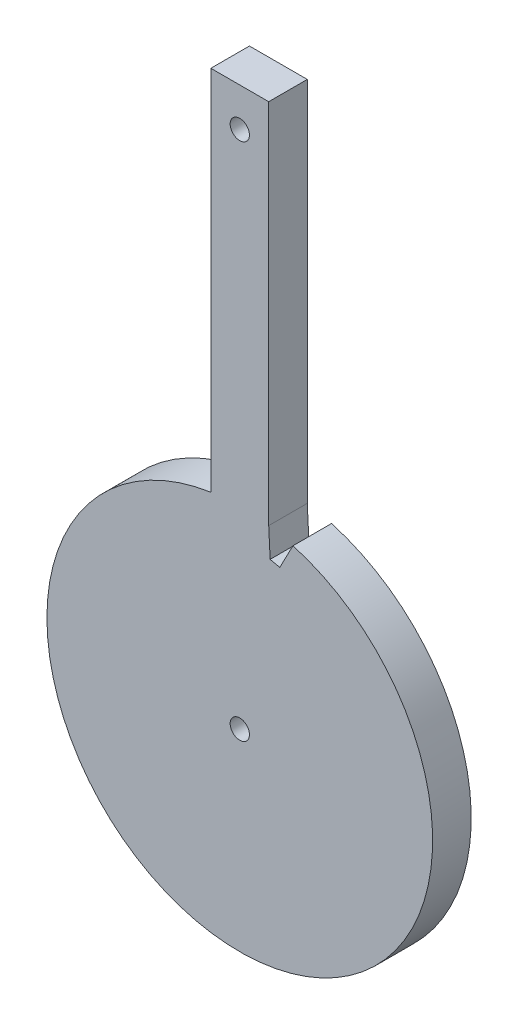
ISO-10303-21;
HEADER;
FILE_DESCRIPTION(('STEP AP214'),'2;1');
FILE_NAME('part.step','',(''),(''),'','','');
FILE_SCHEMA(('AUTOMOTIVE_DESIGN { 1 0 10303 214 1 1 1 1 }'));
ENDSEC;
DATA;
#1=APPLICATION_CONTEXT('core data for automotive mechanical design processes');
#2=APPLICATION_PROTOCOL_DEFINITION('international standard','automotive_design',2000,#1);
#3=PRODUCT_CONTEXT('',#1,'mechanical');
#4=PRODUCT('Part','Part','',(#3));
#5=PRODUCT_RELATED_PRODUCT_CATEGORY('part','',(#4));
#6=PRODUCT_DEFINITION_FORMATION('','',#4);
#7=PRODUCT_DEFINITION_CONTEXT('part definition',#1,'design');
#8=PRODUCT_DEFINITION('design','',#6,#7);
#9=PRODUCT_DEFINITION_SHAPE('','',#8);
#10=(LENGTH_UNIT() NAMED_UNIT(*) SI_UNIT(.MILLI.,.METRE.));
#11=(NAMED_UNIT(*) PLANE_ANGLE_UNIT() SI_UNIT($,.RADIAN.));
#12=(NAMED_UNIT(*) SI_UNIT($,.STERADIAN.) SOLID_ANGLE_UNIT());
#13=UNCERTAINTY_MEASURE_WITH_UNIT(LENGTH_MEASURE(1.E-05),#10,'distance_accuracy_value','');
#14=(GEOMETRIC_REPRESENTATION_CONTEXT(3) GLOBAL_UNCERTAINTY_ASSIGNED_CONTEXT((#13)) GLOBAL_UNIT_ASSIGNED_CONTEXT((#10,
#11,#12)) REPRESENTATION_CONTEXT('',''));
#15=CARTESIAN_POINT('',(0.,0.,0.));
#16=DIRECTION('',(0.,0.,1.));
#17=DIRECTION('',(1.,0.,0.));
#18=AXIS2_PLACEMENT_3D('',#15,#16,#17);
#19=CARTESIAN_POINT('',(0.,0.,-10.));
#20=DIRECTION('',(0.,0.,1.));
#21=DIRECTION('',(1.,0.,0.));
#22=AXIS2_PLACEMENT_3D('',#19,#20,#21);
#23=CYLINDRICAL_SURFACE('',#22,50.);
#24=CARTESIAN_POINT('',(0.,0.,-10.));
#25=DIRECTION('',(0.,0.,1.));
#26=DIRECTION('',(1.,0.,0.));
#27=AXIS2_PLACEMENT_3D('',#24,#25,#26);
#28=CIRCLE('',#27,50.);
#29=CARTESIAN_POINT('',(-7.49999999999999,49.434299833213,-10.));
#30=VERTEX_POINT('',#29);
#31=CARTESIAN_POINT('',(13.7917102938844,48.0602614138704,-10.));
#32=VERTEX_POINT('',#31);
#33=EDGE_CURVE('E120',#30,#32,#28,.T.);
#34=ORIENTED_EDGE('',*,*,#33,.T.);
#35=DIRECTION('',(0.,0.,-1.));
#36=VECTOR('',#35,1.);
#37=CARTESIAN_POINT('',(13.7917102938844,48.0602614138704,-10.));
#38=LINE('',#37,#36);
#39=CARTESIAN_POINT('',(13.7917102938844,48.0602614138704,0.));
#40=VERTEX_POINT('',#39);
#41=EDGE_CURVE('E108',#32,#40,#38,.F.);
#42=ORIENTED_EDGE('',*,*,#41,.T.);
#43=CARTESIAN_POINT('',(0.,0.,0.));
#44=DIRECTION('',(0.,0.,1.));
#45=DIRECTION('',(1.,0.,0.));
#46=AXIS2_PLACEMENT_3D('',#43,#44,#45);
#47=CIRCLE('',#46,50.);
#48=CARTESIAN_POINT('',(-7.49999999999999,49.434299833213,0.));
#49=VERTEX_POINT('',#48);
#50=EDGE_CURVE('E118',#49,#40,#47,.T.);
#51=ORIENTED_EDGE('',*,*,#50,.F.);
#52=DIRECTION('',(0.,0.,1.));
#53=VECTOR('',#52,1.);
#54=CARTESIAN_POINT('',(-7.49999999999999,49.434299833213,-10.));
#55=LINE('',#54,#53);
#56=EDGE_CURVE('E11',#30,#49,#55,.T.);
#57=ORIENTED_EDGE('',*,*,#56,.F.);
#58=EDGE_LOOP('',(#34,#42,#51,#57));
#59=FACE_BOUND('',#58,.T.);
#60=ADVANCED_FACE('F38',(#59),#23,.T.);
#61=CARTESIAN_POINT('',(0.,0.,-10.));
#62=DIRECTION('',(0.,0.,1.));
#63=DIRECTION('',(1.,0.,0.));
#64=AXIS2_PLACEMENT_3D('',#61,#62,#63);
#65=PLANE('',#64);
#66=CARTESIAN_POINT('',(0.,134.62,-10.));
#67=DIRECTION('',(0.,0.,1.));
#68=DIRECTION('',(1.,0.,0.));
#69=AXIS2_PLACEMENT_3D('',#66,#67,#68);
#70=CIRCLE('',#69,2.5);
#71=CARTESIAN_POINT('',(2.5,134.62,-10.));
#72=VERTEX_POINT('',#71);
#73=EDGE_CURVE('E126',#72,#72,#70,.F.);
#74=ORIENTED_EDGE('',*,*,#73,.F.);
#75=EDGE_LOOP('',(#74));
#76=FACE_BOUND('',#75,.T.);
#77=CARTESIAN_POINT('',(0.,0.,-10.));
#78=DIRECTION('',(0.,0.,1.));
#79=DIRECTION('',(1.,0.,0.));
#80=AXIS2_PLACEMENT_3D('',#77,#78,#79);
#81=CIRCLE('',#80,2.5);
#82=CARTESIAN_POINT('',(2.5,0.,-10.));
#83=VERTEX_POINT('',#82);
#84=EDGE_CURVE('E154',#83,#83,#81,.F.);
#85=ORIENTED_EDGE('',*,*,#84,.F.);
#86=EDGE_LOOP('',(#85));
#87=FACE_BOUND('',#86,.T.);
#88=DIRECTION('',(-0.0502280357856031,0.998737775605349,0.));
#89=VECTOR('',#88,1.);
#90=CARTESIAN_POINT('',(7.5,49.434299833213,-10.));
#91=LINE('',#90,#89);
#92=CARTESIAN_POINT('',(7.87168746481346,42.0436402937334,-10.));
#93=VERTEX_POINT('',#92);
#94=CARTESIAN_POINT('',(7.5,49.434299833213,-10.));
#95=VERTEX_POINT('',#94);
#96=EDGE_CURVE('E116',#93,#95,#91,.T.);
#97=ORIENTED_EDGE('',*,*,#96,.F.);
#98=DIRECTION('',(-0.976973648118693,0.213360003003499,0.));
#99=VECTOR('',#98,1.);
#100=CARTESIAN_POINT('',(7.87168746481346,42.0436402937334,-10.));
#101=LINE('',#100,#99);
#102=CARTESIAN_POINT('',(10.3727400039973,41.4974386860444,-10.));
#103=VERTEX_POINT('',#102);
#104=EDGE_CURVE('E164',#103,#93,#101,.T.);
#105=ORIENTED_EDGE('',*,*,#104,.F.);
#106=DIRECTION('',(-0.4620230121469,-0.886867936192704,0.));
#107=VECTOR('',#106,1.);
#108=CARTESIAN_POINT('',(10.3727400039973,41.4974386860444,-10.));
#109=LINE('',#108,#107);
#110=EDGE_CURVE('E166',#32,#103,#109,.T.);
#111=ORIENTED_EDGE('',*,*,#110,.F.);
#112=ORIENTED_EDGE('',*,*,#33,.F.);
#113=DIRECTION('',(0.,-1.,0.));
#114=VECTOR('',#113,1.);
#115=CARTESIAN_POINT('',(-7.5,144.62,-10.));
#116=LINE('',#115,#114);
#117=CARTESIAN_POINT('',(-7.5,144.62,-10.));
#118=VERTEX_POINT('',#117);
#119=EDGE_CURVE('E135',#118,#30,#116,.T.);
#120=ORIENTED_EDGE('',*,*,#119,.F.);
#121=DIRECTION('',(-1.,0.,0.));
#122=VECTOR('',#121,1.);
#123=CARTESIAN_POINT('',(7.5,144.62,-10.));
#124=LINE('',#123,#122);
#125=CARTESIAN_POINT('',(7.5,144.62,-10.));
#126=VERTEX_POINT('',#125);
#127=EDGE_CURVE('E146',#126,#118,#124,.T.);
#128=ORIENTED_EDGE('',*,*,#127,.F.);
#129=DIRECTION('',(0.,1.,0.));
#130=VECTOR('',#129,1.);
#131=CARTESIAN_POINT('',(7.5,49.434299833213,-10.));
#132=LINE('',#131,#130);
#133=EDGE_CURVE('E148',#95,#126,#132,.T.);
#134=ORIENTED_EDGE('',*,*,#133,.F.);
#135=EDGE_LOOP('',(#97,#105,#111,#112,#120,#128,#134));
#136=FACE_BOUND('',#135,.T.);
#137=ADVANCED_FACE('F173',(#76,#87,#136),#65,.F.);
#138=CARTESIAN_POINT('',(0.,0.,0.));
#139=DIRECTION('',(0.,0.,1.));
#140=DIRECTION('',(1.,0.,0.));
#141=AXIS2_PLACEMENT_3D('',#138,#139,#140);
#142=PLANE('',#141);
#143=CARTESIAN_POINT('',(0.,134.62,0.));
#144=DIRECTION('',(0.,0.,1.));
#145=DIRECTION('',(1.,0.,0.));
#146=AXIS2_PLACEMENT_3D('',#143,#144,#145);
#147=CIRCLE('',#146,2.5);
#148=CARTESIAN_POINT('',(2.5,134.62,0.));
#149=VERTEX_POINT('',#148);
#150=EDGE_CURVE('E132',#149,#149,#147,.T.);
#151=ORIENTED_EDGE('',*,*,#150,.F.);
#152=EDGE_LOOP('',(#151));
#153=FACE_BOUND('',#152,.T.);
#154=CARTESIAN_POINT('',(0.,0.,0.));
#155=DIRECTION('',(0.,0.,1.));
#156=DIRECTION('',(1.,0.,0.));
#157=AXIS2_PLACEMENT_3D('',#154,#155,#156);
#158=CIRCLE('',#157,2.5);
#159=CARTESIAN_POINT('',(2.5,0.,0.));
#160=VERTEX_POINT('',#159);
#161=EDGE_CURVE('E157',#160,#160,#158,.T.);
#162=ORIENTED_EDGE('',*,*,#161,.F.);
#163=EDGE_LOOP('',(#162));
#164=FACE_BOUND('',#163,.T.);
#165=DIRECTION('',(-0.976973648118693,0.213360003003499,0.));
#166=VECTOR('',#165,1.);
#167=CARTESIAN_POINT('',(7.87168746481346,42.0436402937334,0.));
#168=LINE('',#167,#166);
#169=CARTESIAN_POINT('',(10.3727400039973,41.4974386860444,0.));
#170=VERTEX_POINT('',#169);
#171=CARTESIAN_POINT('',(7.87168746481346,42.0436402937334,0.));
#172=VERTEX_POINT('',#171);
#173=EDGE_CURVE('E115',#170,#172,#168,.T.);
#174=ORIENTED_EDGE('',*,*,#173,.T.);
#175=DIRECTION('',(-0.0502280357856031,0.998737775605349,0.));
#176=VECTOR('',#175,1.);
#177=CARTESIAN_POINT('',(7.5,49.434299833213,0.));
#178=LINE('',#177,#176);
#179=CARTESIAN_POINT('',(7.5,49.434299833213,0.));
#180=VERTEX_POINT('',#179);
#181=EDGE_CURVE('E161',#172,#180,#178,.T.);
#182=ORIENTED_EDGE('',*,*,#181,.T.);
#183=DIRECTION('',(0.,1.,0.));
#184=VECTOR('',#183,1.);
#185=CARTESIAN_POINT('',(7.5,49.434299833213,0.));
#186=LINE('',#185,#184);
#187=CARTESIAN_POINT('',(7.5,144.62,0.));
#188=VERTEX_POINT('',#187);
#189=EDGE_CURVE('E125',#180,#188,#186,.T.);
#190=ORIENTED_EDGE('',*,*,#189,.T.);
#191=DIRECTION('',(-1.,0.,0.));
#192=VECTOR('',#191,1.);
#193=CARTESIAN_POINT('',(7.5,144.62,0.));
#194=LINE('',#193,#192);
#195=CARTESIAN_POINT('',(-7.5,144.62,0.));
#196=VERTEX_POINT('',#195);
#197=EDGE_CURVE('E129',#188,#196,#194,.T.);
#198=ORIENTED_EDGE('',*,*,#197,.T.);
#199=DIRECTION('',(0.,-1.,0.));
#200=VECTOR('',#199,1.);
#201=CARTESIAN_POINT('',(-7.5,144.62,0.));
#202=LINE('',#201,#200);
#203=EDGE_CURVE('E124',#196,#49,#202,.T.);
#204=ORIENTED_EDGE('',*,*,#203,.T.);
#205=ORIENTED_EDGE('',*,*,#50,.T.);
#206=DIRECTION('',(-0.4620230121469,-0.886867936192704,0.));
#207=VECTOR('',#206,1.);
#208=CARTESIAN_POINT('',(10.3727400039973,41.4974386860444,0.));
#209=LINE('',#208,#207);
#210=EDGE_CURVE('E105',#40,#170,#209,.T.);
#211=ORIENTED_EDGE('',*,*,#210,.T.);
#212=EDGE_LOOP('',(#174,#182,#190,#198,#204,#205,#211));
#213=FACE_BOUND('',#212,.T.);
#214=ADVANCED_FACE('F122',(#153,#164,#213),#142,.T.);
#215=CARTESIAN_POINT('',(-7.5,144.62,-10.));
#216=DIRECTION('',(-1.,0.,0.));
#217=DIRECTION('',(0.,-1.,0.));
#218=AXIS2_PLACEMENT_3D('',#215,#216,#217);
#219=PLANE('',#218);
#220=ORIENTED_EDGE('',*,*,#203,.F.);
#221=DIRECTION('',(0.,0.,1.));
#222=VECTOR('',#221,1.);
#223=CARTESIAN_POINT('',(-7.5,144.62,-10.));
#224=LINE('',#223,#222);
#225=EDGE_CURVE('E46',#118,#196,#224,.T.);
#226=ORIENTED_EDGE('',*,*,#225,.F.);
#227=ORIENTED_EDGE('',*,*,#119,.T.);
#228=ORIENTED_EDGE('',*,*,#56,.T.);
#229=EDGE_LOOP('',(#220,#226,#227,#228));
#230=FACE_BOUND('',#229,.T.);
#231=ADVANCED_FACE('F200',(#230),#219,.T.);
#232=CARTESIAN_POINT('',(7.5,144.62,-10.));
#233=DIRECTION('',(0.,1.,0.));
#234=DIRECTION('',(0.,0.,1.));
#235=AXIS2_PLACEMENT_3D('',#232,#233,#234);
#236=PLANE('',#235);
#237=ORIENTED_EDGE('',*,*,#197,.F.);
#238=DIRECTION('',(0.,0.,1.));
#239=VECTOR('',#238,1.);
#240=CARTESIAN_POINT('',(7.5,144.62,-10.));
#241=LINE('',#240,#239);
#242=EDGE_CURVE('E82',#126,#188,#241,.T.);
#243=ORIENTED_EDGE('',*,*,#242,.F.);
#244=ORIENTED_EDGE('',*,*,#127,.T.);
#245=ORIENTED_EDGE('',*,*,#225,.T.);
#246=EDGE_LOOP('',(#237,#243,#244,#245));
#247=FACE_BOUND('',#246,.T.);
#248=ADVANCED_FACE('F209',(#247),#236,.T.);
#249=CARTESIAN_POINT('',(7.5,49.434299833213,-10.));
#250=DIRECTION('',(1.,0.,0.));
#251=DIRECTION('',(0.,1.,0.));
#252=AXIS2_PLACEMENT_3D('',#249,#250,#251);
#253=PLANE('',#252);
#254=ORIENTED_EDGE('',*,*,#189,.F.);
#255=DIRECTION('',(0.,0.,1.));
#256=VECTOR('',#255,1.);
#257=CARTESIAN_POINT('',(7.5,49.434299833213,-10.));
#258=LINE('',#257,#256);
#259=EDGE_CURVE('E41',#95,#180,#258,.T.);
#260=ORIENTED_EDGE('',*,*,#259,.F.);
#261=ORIENTED_EDGE('',*,*,#133,.T.);
#262=ORIENTED_EDGE('',*,*,#242,.T.);
#263=EDGE_LOOP('',(#254,#260,#261,#262));
#264=FACE_BOUND('',#263,.T.);
#265=ADVANCED_FACE('F169',(#264),#253,.T.);
#266=CARTESIAN_POINT('',(0.,134.62,-10.001));
#267=DIRECTION('',(0.,0.,1.));
#268=DIRECTION('',(1.,0.,0.));
#269=AXIS2_PLACEMENT_3D('',#266,#267,#268);
#270=CYLINDRICAL_SURFACE('',#269,2.5);
#271=ORIENTED_EDGE('',*,*,#150,.T.);
#272=EDGE_LOOP('',(#271));
#273=FACE_BOUND('',#272,.T.);
#274=ORIENTED_EDGE('',*,*,#73,.T.);
#275=EDGE_LOOP('',(#274));
#276=FACE_BOUND('',#275,.T.);
#277=ADVANCED_FACE('F186',(#273,#276),#270,.F.);
#278=CARTESIAN_POINT('',(0.,0.,-10.001));
#279=DIRECTION('',(0.,0.,1.));
#280=DIRECTION('',(1.,0.,0.));
#281=AXIS2_PLACEMENT_3D('',#278,#279,#280);
#282=CYLINDRICAL_SURFACE('',#281,2.5);
#283=ORIENTED_EDGE('',*,*,#161,.T.);
#284=EDGE_LOOP('',(#283));
#285=FACE_BOUND('',#284,.T.);
#286=ORIENTED_EDGE('',*,*,#84,.T.);
#287=EDGE_LOOP('',(#286));
#288=FACE_BOUND('',#287,.T.);
#289=ADVANCED_FACE('F178',(#285,#288),#282,.F.);
#290=CARTESIAN_POINT('',(7.5,49.434299833213,-10.));
#291=DIRECTION('',(0.998737775605349,0.0502280357856031,0.));
#292=DIRECTION('',(-0.0502280357856031,0.998737775605349,0.));
#293=AXIS2_PLACEMENT_3D('',#290,#291,#292);
#294=PLANE('',#293);
#295=DIRECTION('',(0.,0.,-1.));
#296=VECTOR('',#295,1.);
#297=CARTESIAN_POINT('',(7.87168746481346,42.0436402937334,-10.));
#298=LINE('',#297,#296);
#299=EDGE_CURVE('E54',#93,#172,#298,.F.);
#300=ORIENTED_EDGE('',*,*,#299,.F.);
#301=ORIENTED_EDGE('',*,*,#96,.T.);
#302=ORIENTED_EDGE('',*,*,#259,.T.);
#303=ORIENTED_EDGE('',*,*,#181,.F.);
#304=EDGE_LOOP('',(#300,#301,#302,#303));
#305=FACE_BOUND('',#304,.T.);
#306=ADVANCED_FACE('F176',(#305),#294,.T.);
#307=CARTESIAN_POINT('',(10.3727400039973,41.4974386860444,-10.));
#308=DIRECTION('',(-0.886867936192704,0.4620230121469,0.));
#309=DIRECTION('',(-0.4620230121469,-0.886867936192704,0.));
#310=AXIS2_PLACEMENT_3D('',#307,#308,#309);
#311=PLANE('',#310);
#312=ORIENTED_EDGE('',*,*,#41,.F.);
#313=ORIENTED_EDGE('',*,*,#110,.T.);
#314=DIRECTION('',(0.,0.,-1.));
#315=VECTOR('',#314,1.);
#316=CARTESIAN_POINT('',(10.3727400039973,41.4974386860444,-10.));
#317=LINE('',#316,#315);
#318=EDGE_CURVE('E111',#103,#170,#317,.F.);
#319=ORIENTED_EDGE('',*,*,#318,.T.);
#320=ORIENTED_EDGE('',*,*,#210,.F.);
#321=EDGE_LOOP('',(#312,#313,#319,#320));
#322=FACE_BOUND('',#321,.T.);
#323=ADVANCED_FACE('F107',(#322),#311,.T.);
#324=CARTESIAN_POINT('',(7.87168746481346,42.0436402937334,-10.));
#325=DIRECTION('',(0.213360003003499,0.976973648118693,0.));
#326=DIRECTION('',(-0.976973648118693,0.213360003003499,0.));
#327=AXIS2_PLACEMENT_3D('',#324,#325,#326);
#328=PLANE('',#327);
#329=ORIENTED_EDGE('',*,*,#104,.T.);
#330=ORIENTED_EDGE('',*,*,#299,.T.);
#331=ORIENTED_EDGE('',*,*,#173,.F.);
#332=ORIENTED_EDGE('',*,*,#318,.F.);
#333=EDGE_LOOP('',(#329,#330,#331,#332));
#334=FACE_BOUND('',#333,.T.);
#335=ADVANCED_FACE('F175',(#334),#328,.T.);
#336=CLOSED_SHELL('',(#60,#137,#214,#231,#248,#265,#277,#289,#306,#323,#335));
#337=MANIFOLD_SOLID_BREP('B2',#336);
#338=ADVANCED_BREP_SHAPE_REPRESENTATION('',(#18,#337),#14);
#339=SHAPE_DEFINITION_REPRESENTATION(#9,#338);
ENDSEC;
END-ISO-10303-21;
